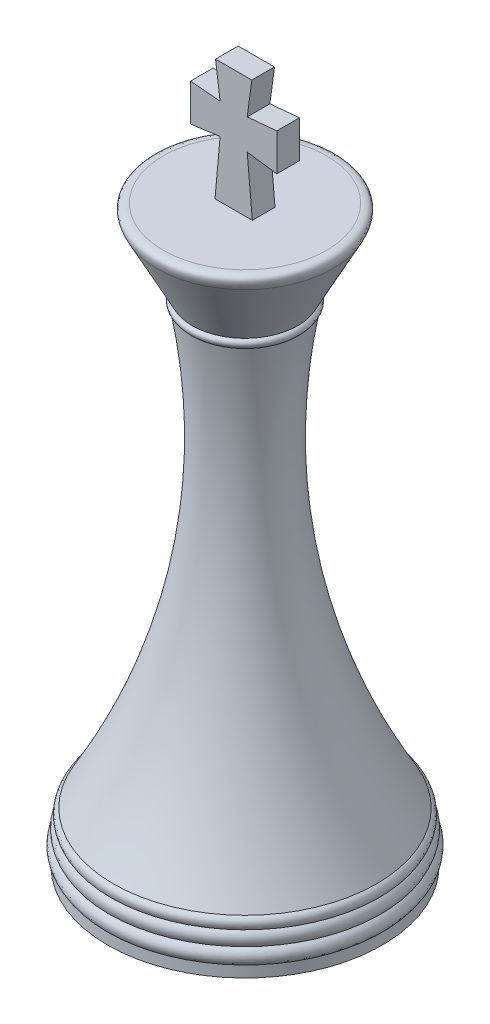
ISO-10303-21;
HEADER;
FILE_DESCRIPTION(('STEP AP214'),'2;1');
FILE_NAME('part.step','',(''),(''),'','','');
FILE_SCHEMA(('AUTOMOTIVE_DESIGN { 1 0 10303 214 1 1 1 1 }'));
ENDSEC;
DATA;
#1=APPLICATION_CONTEXT('core data for automotive mechanical design processes');
#2=APPLICATION_PROTOCOL_DEFINITION('international standard','automotive_design',2000,#1);
#3=PRODUCT_CONTEXT('',#1,'mechanical');
#4=PRODUCT('Part','Part','',(#3));
#5=PRODUCT_RELATED_PRODUCT_CATEGORY('part','',(#4));
#6=PRODUCT_DEFINITION_FORMATION('','',#4);
#7=PRODUCT_DEFINITION_CONTEXT('part definition',#1,'design');
#8=PRODUCT_DEFINITION('design','',#6,#7);
#9=PRODUCT_DEFINITION_SHAPE('','',#8);
#10=(LENGTH_UNIT() NAMED_UNIT(*) SI_UNIT(.MILLI.,.METRE.));
#11=(NAMED_UNIT(*) PLANE_ANGLE_UNIT() SI_UNIT($,.RADIAN.));
#12=(NAMED_UNIT(*) SI_UNIT($,.STERADIAN.) SOLID_ANGLE_UNIT());
#13=UNCERTAINTY_MEASURE_WITH_UNIT(LENGTH_MEASURE(1.E-05),#10,'distance_accuracy_value','');
#14=(GEOMETRIC_REPRESENTATION_CONTEXT(3) GLOBAL_UNCERTAINTY_ASSIGNED_CONTEXT((#13)) GLOBAL_UNIT_ASSIGNED_CONTEXT((#10,
#11,#12)) REPRESENTATION_CONTEXT('',''));
#15=CARTESIAN_POINT('',(0.,0.,0.));
#16=DIRECTION('',(0.,0.,1.));
#17=DIRECTION('',(1.,0.,0.));
#18=AXIS2_PLACEMENT_3D('',#15,#16,#17);
#19=CARTESIAN_POINT('',(-10.8356310623342,40.9219587784721,0.));
#20=DIRECTION('',(0.,1.,0.));
#21=DIRECTION('',(0.,0.,1.));
#22=AXIS2_PLACEMENT_3D('',#19,#20,#21);
#23=PLANE('',#22);
#24=DIRECTION('',(1.,0.,0.));
#25=VECTOR('',#24,1.);
#26=CARTESIAN_POINT('',(2.47207256425345,40.9219587784721,-1.5));
#27=LINE('',#26,#25);
#28=CARTESIAN_POINT('',(-2.47207256425345,40.9219587784721,-1.5));
#29=VERTEX_POINT('',#28);
#30=CARTESIAN_POINT('',(2.47207256425345,40.9219587784721,-1.5));
#31=VERTEX_POINT('',#30);
#32=EDGE_CURVE('E218',#29,#31,#27,.T.);
#33=ORIENTED_EDGE('',*,*,#32,.T.);
#34=DIRECTION('',(0.,0.,1.));
#35=VECTOR('',#34,1.);
#36=CARTESIAN_POINT('',(2.47207256425345,40.9219587784721,-1.5));
#37=LINE('',#36,#35);
#38=CARTESIAN_POINT('',(2.47207256425345,40.9219587784721,1.5));
#39=VERTEX_POINT('',#38);
#40=EDGE_CURVE('E249',#31,#39,#37,.T.);
#41=ORIENTED_EDGE('',*,*,#40,.T.);
#42=DIRECTION('',(1.,0.,0.));
#43=VECTOR('',#42,1.);
#44=CARTESIAN_POINT('',(2.47207256425345,40.9219587784721,1.5));
#45=LINE('',#44,#43);
#46=CARTESIAN_POINT('',(-2.47207256425345,40.9219587784721,1.5));
#47=VERTEX_POINT('',#46);
#48=EDGE_CURVE('E177',#47,#39,#45,.T.);
#49=ORIENTED_EDGE('',*,*,#48,.F.);
#50=DIRECTION('',(0.,0.,1.));
#51=VECTOR('',#50,1.);
#52=CARTESIAN_POINT('',(-2.47207256425345,40.9219587784721,-1.5));
#53=LINE('',#52,#51);
#54=EDGE_CURVE('E253',#29,#47,#53,.T.);
#55=ORIENTED_EDGE('',*,*,#54,.F.);
#56=EDGE_LOOP('',(#33,#41,#49,#55));
#57=FACE_BOUND('',#56,.T.);
#58=CARTESIAN_POINT('',(0.,40.9219587784721,0.));
#59=DIRECTION('',(0.,1.,0.));
#60=DIRECTION('',(0.,0.,1.));
#61=AXIS2_PLACEMENT_3D('',#58,#59,#60);
#62=CIRCLE('',#61,10.8356310623342);
#63=CARTESIAN_POINT('',(0.,40.9219587784721,10.8356310623342));
#64=VERTEX_POINT('',#63);
#65=EDGE_CURVE('E11',#64,#64,#62,.T.);
#66=ORIENTED_EDGE('',*,*,#65,.T.);
#67=EDGE_LOOP('',(#66));
#68=FACE_BOUND('',#67,.T.);
#69=ADVANCED_FACE('F45',(#57,#68),#23,.T.);
#70=CARTESIAN_POINT('',(-10.8356310623342,40.9219587784721,0.));
#71=CARTESIAN_POINT('',(-12.5761824205052,40.9903553282257,0.));
#72=CARTESIAN_POINT('',(-11.6210541476617,39.1907467913078,0.));
#73=B_SPLINE_CURVE_WITH_KNOTS('',2,(#70,#71,#72),.UNSPECIFIED.,.F.,.F.,(3,3),(0.,1.),.UNSPECIFIED.);
#74=CARTESIAN_POINT('',(0.,55.2312224518818,0.));
#75=DIRECTION('',(0.,1.,0.));
#76=AXIS1_PLACEMENT('',#74,#75);
#77=SURFACE_OF_REVOLUTION('',#73,#76);
#78=CARTESIAN_POINT('',(0.,39.1907467913078,0.));
#79=DIRECTION('',(0.,1.,0.));
#80=DIRECTION('',(0.,0.,1.));
#81=AXIS2_PLACEMENT_3D('',#78,#79,#80);
#82=CIRCLE('',#81,11.6210541476617);
#83=CARTESIAN_POINT('',(0.,39.1907467913078,11.6210541476617));
#84=VERTEX_POINT('',#83);
#85=EDGE_CURVE('E53',#84,#84,#82,.T.);
#86=ORIENTED_EDGE('',*,*,#85,.T.);
#87=EDGE_LOOP('',(#86));
#88=FACE_BOUND('',#87,.T.);
#89=ORIENTED_EDGE('',*,*,#65,.F.);
#90=EDGE_LOOP('',(#89));
#91=FACE_BOUND('',#90,.T.);
#92=ADVANCED_FACE('F281',(#88,#91),#77,.F.);
#93=CARTESIAN_POINT('',(0.,39.1907467913078,0.));
#94=DIRECTION('',(0.,1.,0.));
#95=DIRECTION('',(0.,0.,1.));
#96=AXIS2_PLACEMENT_3D('',#93,#94,#95);
#97=CONICAL_SURFACE('',#96,11.6210541476617,0.482185268462013);
#98=CARTESIAN_POINT('',(0.,30.3445693469213,0.));
#99=DIRECTION('',(0.,1.,0.));
#100=DIRECTION('',(0.,0.,1.));
#101=AXIS2_PLACEMENT_3D('',#98,#99,#100);
#102=CIRCLE('',#101,6.99103947930708);
#103=CARTESIAN_POINT('',(0.,30.3445693469213,6.99103947930708));
#104=VERTEX_POINT('',#103);
#105=EDGE_CURVE('E560',#104,#104,#102,.T.);
#106=ORIENTED_EDGE('',*,*,#105,.T.);
#107=EDGE_LOOP('',(#106));
#108=FACE_BOUND('',#107,.T.);
#109=ORIENTED_EDGE('',*,*,#85,.F.);
#110=EDGE_LOOP('',(#109));
#111=FACE_BOUND('',#110,.T.);
#112=ADVANCED_FACE('F284',(#108,#111),#97,.T.);
#113=CARTESIAN_POINT('',(-6.99103947930708,30.3445693469213,0.));
#114=CARTESIAN_POINT('',(-7.42282302865958,30.1336937370813,0.));
#115=CARTESIAN_POINT('',(-7.55993891484378,29.704191996618,0.));
#116=CARTESIAN_POINT('',(-7.02337529144291,29.1899792792963,0.));
#117=B_SPLINE_CURVE_WITH_KNOTS('',3,(#113,#114,#115,#116),.UNSPECIFIED.,.F.,.F.,(4,4),(0.,1.),.UNSPECIFIED.);
#118=CARTESIAN_POINT('',(0.,55.2312224518818,0.));
#119=DIRECTION('',(0.,1.,0.));
#120=AXIS1_PLACEMENT('',#118,#119);
#121=SURFACE_OF_REVOLUTION('',#117,#120);
#122=CARTESIAN_POINT('',(0.,29.1899792792963,0.));
#123=DIRECTION('',(0.,1.,0.));
#124=DIRECTION('',(0.,0.,1.));
#125=AXIS2_PLACEMENT_3D('',#122,#123,#124);
#126=CIRCLE('',#125,7.02337529144291);
#127=CARTESIAN_POINT('',(0.,29.1899792792963,7.02337529144291));
#128=VERTEX_POINT('',#127);
#129=EDGE_CURVE('E555',#128,#128,#126,.T.);
#130=ORIENTED_EDGE('',*,*,#129,.T.);
#131=EDGE_LOOP('',(#130));
#132=FACE_BOUND('',#131,.T.);
#133=ORIENTED_EDGE('',*,*,#105,.F.);
#134=EDGE_LOOP('',(#133));
#135=FACE_BOUND('',#134,.T.);
#136=ADVANCED_FACE('F288',(#132,#135),#121,.F.);
#137=CARTESIAN_POINT('',(-7.02337529144291,29.1899792792963,0.));
#138=CARTESIAN_POINT('',(-1.65074427356781,-0.748893792947071,0.));
#139=CARTESIAN_POINT('',(-17.4406708588037,-28.4410692304664,0.));
#140=B_SPLINE_CURVE_WITH_KNOTS('',2,(#137,#138,#139),.UNSPECIFIED.,.F.,.F.,(3,3),(0.,1.),.UNSPECIFIED.);
#141=CARTESIAN_POINT('',(0.,55.2312224518818,0.));
#142=DIRECTION('',(0.,1.,0.));
#143=AXIS1_PLACEMENT('',#141,#142);
#144=SURFACE_OF_REVOLUTION('',#140,#143);
#145=CARTESIAN_POINT('',(0.,-28.4410692304664,0.));
#146=DIRECTION('',(0.,1.,0.));
#147=DIRECTION('',(0.,0.,1.));
#148=AXIS2_PLACEMENT_3D('',#145,#146,#147);
#149=CIRCLE('',#148,17.4406708588037);
#150=CARTESIAN_POINT('',(0.,-28.4410692304664,17.4406708588037));
#151=VERTEX_POINT('',#150);
#152=EDGE_CURVE('E553',#151,#151,#149,.T.);
#153=ORIENTED_EDGE('',*,*,#152,.T.);
#154=EDGE_LOOP('',(#153));
#155=FACE_BOUND('',#154,.T.);
#156=ORIENTED_EDGE('',*,*,#129,.F.);
#157=EDGE_LOOP('',(#156));
#158=FACE_BOUND('',#157,.T.);
#159=ADVANCED_FACE('F292',(#155,#158),#144,.F.);
#160=CARTESIAN_POINT('',(-17.4406708588037,-28.4410692304664,0.));
#161=CARTESIAN_POINT('',(-18.2383972493109,-28.9552709631702,0.));
#162=CARTESIAN_POINT('',(-17.7523294859476,-29.8824903810067,0.));
#163=B_SPLINE_CURVE_WITH_KNOTS('',2,(#160,#161,#162),.UNSPECIFIED.,.F.,.F.,(3,3),(0.,1.),.UNSPECIFIED.);
#164=CARTESIAN_POINT('',(0.,55.2312224518818,0.));
#165=DIRECTION('',(0.,1.,0.));
#166=AXIS1_PLACEMENT('',#164,#165);
#167=SURFACE_OF_REVOLUTION('',#163,#166);
#168=CARTESIAN_POINT('',(0.,-29.8824903810067,0.));
#169=DIRECTION('',(0.,1.,0.));
#170=DIRECTION('',(0.,0.,1.));
#171=AXIS2_PLACEMENT_3D('',#168,#169,#170);
#172=CIRCLE('',#171,17.7523294859476);
#173=CARTESIAN_POINT('',(0.,-29.8824903810067,17.7523294859476));
#174=VERTEX_POINT('',#173);
#175=EDGE_CURVE('E550',#174,#174,#172,.T.);
#176=ORIENTED_EDGE('',*,*,#175,.T.);
#177=EDGE_LOOP('',(#176));
#178=FACE_BOUND('',#177,.T.);
#179=ORIENTED_EDGE('',*,*,#152,.F.);
#180=EDGE_LOOP('',(#179));
#181=FACE_BOUND('',#180,.T.);
#182=ADVANCED_FACE('F296',(#178,#181),#167,.F.);
#183=CARTESIAN_POINT('',(-17.7523294859476,-29.8824903810067,0.));
#184=CARTESIAN_POINT('',(-18.565257787873,-30.6179166788361,0.));
#185=CARTESIAN_POINT('',(-17.9784864878763,-31.656539775019,0.));
#186=B_SPLINE_CURVE_WITH_KNOTS('',2,(#183,#184,#185),.UNSPECIFIED.,.F.,.F.,(3,3),(0.,1.),.UNSPECIFIED.);
#187=CARTESIAN_POINT('',(0.,55.2312224518818,0.));
#188=DIRECTION('',(0.,1.,0.));
#189=AXIS1_PLACEMENT('',#187,#188);
#190=SURFACE_OF_REVOLUTION('',#186,#189);
#191=CARTESIAN_POINT('',(0.,-31.656539775019,0.));
#192=DIRECTION('',(0.,1.,0.));
#193=DIRECTION('',(0.,0.,1.));
#194=AXIS2_PLACEMENT_3D('',#191,#192,#193);
#195=CIRCLE('',#194,17.9784864878763);
#196=CARTESIAN_POINT('',(0.,-31.656539775019,17.9784864878763));
#197=VERTEX_POINT('',#196);
#198=EDGE_CURVE('E562',#197,#197,#195,.T.);
#199=ORIENTED_EDGE('',*,*,#198,.T.);
#200=EDGE_LOOP('',(#199));
#201=FACE_BOUND('',#200,.T.);
#202=ORIENTED_EDGE('',*,*,#175,.F.);
#203=EDGE_LOOP('',(#202));
#204=FACE_BOUND('',#203,.T.);
#205=ADVANCED_FACE('F324',(#201,#204),#190,.F.);
#206=CARTESIAN_POINT('',(-17.9784864878763,-31.656539775019,0.));
#207=CARTESIAN_POINT('',(-18.649381124143,-32.2176109902792,0.));
#208=CARTESIAN_POINT('',(-18.7467778361812,-32.9387169198661,0.));
#209=CARTESIAN_POINT('',(-18.1746290266333,-33.6223939067329,0.));
#210=B_SPLINE_CURVE_WITH_KNOTS('',3,(#206,#207,#208,#209),.UNSPECIFIED.,.F.,.F.,(4,4),(0.,1.),.UNSPECIFIED.);
#211=CARTESIAN_POINT('',(0.,55.2312224518818,0.));
#212=DIRECTION('',(0.,1.,0.));
#213=AXIS1_PLACEMENT('',#211,#212);
#214=SURFACE_OF_REVOLUTION('',#210,#213);
#215=CARTESIAN_POINT('',(0.,-33.6223939067329,0.));
#216=DIRECTION('',(0.,1.,0.));
#217=DIRECTION('',(0.,0.,1.));
#218=AXIS2_PLACEMENT_3D('',#215,#216,#217);
#219=CIRCLE('',#218,18.1746290266333);
#220=CARTESIAN_POINT('',(0.,-33.6223939067329,18.1746290266333));
#221=VERTEX_POINT('',#220);
#222=EDGE_CURVE('E577',#221,#221,#219,.T.);
#223=ORIENTED_EDGE('',*,*,#222,.T.);
#224=EDGE_LOOP('',(#223));
#225=FACE_BOUND('',#224,.T.);
#226=ORIENTED_EDGE('',*,*,#198,.F.);
#227=EDGE_LOOP('',(#226));
#228=FACE_BOUND('',#227,.T.);
#229=ADVANCED_FACE('F327',(#225,#228),#214,.F.);
#230=CARTESIAN_POINT('',(0.,55.2312224518818,0.));
#231=DIRECTION('',(0.,1.,0.));
#232=DIRECTION('',(0.,0.,1.));
#233=AXIS2_PLACEMENT_3D('',#230,#231,#232);
#234=CYLINDRICAL_SURFACE('',#233,18.1746290266333);
#235=CARTESIAN_POINT('',(0.,-35.1126054521372,0.));
#236=DIRECTION('',(0.,1.,0.));
#237=DIRECTION('',(0.,0.,1.));
#238=AXIS2_PLACEMENT_3D('',#235,#236,#237);
#239=CIRCLE('',#238,18.1746290266333);
#240=CARTESIAN_POINT('',(0.,-35.1126054521372,18.1746290266333));
#241=VERTEX_POINT('',#240);
#242=EDGE_CURVE('E239',#241,#241,#239,.T.);
#243=ORIENTED_EDGE('',*,*,#242,.T.);
#244=EDGE_LOOP('',(#243));
#245=FACE_BOUND('',#244,.T.);
#246=ORIENTED_EDGE('',*,*,#222,.F.);
#247=EDGE_LOOP('',(#246));
#248=FACE_BOUND('',#247,.T.);
#249=ADVANCED_FACE('F331',(#245,#248),#234,.T.);
#250=CARTESIAN_POINT('',(0.,-35.1126054521372,0.));
#251=DIRECTION('',(0.,-1.,0.));
#252=DIRECTION('',(0.,0.,-1.));
#253=AXIS2_PLACEMENT_3D('',#250,#251,#252);
#254=PLANE('',#253);
#255=ORIENTED_EDGE('',*,*,#242,.F.);
#256=EDGE_LOOP('',(#255));
#257=FACE_BOUND('',#256,.T.);
#258=ADVANCED_FACE('F335',(#257),#254,.T.);
#259=CARTESIAN_POINT('',(1.79345498502959,52.4487400912058,-1.5));
#260=DIRECTION('',(0.991029227048475,-0.133645318420446,0.));
#261=DIRECTION('',(0.133645318420446,0.991029227048475,0.));
#262=AXIS2_PLACEMENT_3D('',#259,#260,#261);
#263=PLANE('',#262);
#264=DIRECTION('',(0.,0.,1.));
#265=VECTOR('',#264,1.);
#266=CARTESIAN_POINT('',(2.40460317666927,56.9806288781166,-1.5));
#267=LINE('',#266,#265);
#268=CARTESIAN_POINT('',(2.40460317666927,56.9806288781166,-1.5));
#269=VERTEX_POINT('',#268);
#270=CARTESIAN_POINT('',(2.40460317666927,56.9806288781166,1.5));
#271=VERTEX_POINT('',#270);
#272=EDGE_CURVE('E133',#269,#271,#267,.T.);
#273=ORIENTED_EDGE('',*,*,#272,.T.);
#274=DIRECTION('',(0.133645318420446,0.991029227048475,0.));
#275=VECTOR('',#274,1.);
#276=CARTESIAN_POINT('',(1.79345498502959,52.4487400912058,1.5));
#277=LINE('',#276,#275);
#278=CARTESIAN_POINT('',(1.79345498502959,52.4487400912058,1.5));
#279=VERTEX_POINT('',#278);
#280=EDGE_CURVE('E137',#279,#271,#277,.T.);
#281=ORIENTED_EDGE('',*,*,#280,.F.);
#282=DIRECTION('',(0.,0.,1.));
#283=VECTOR('',#282,1.);
#284=CARTESIAN_POINT('',(1.79345498502959,52.4487400912058,-1.5));
#285=LINE('',#284,#283);
#286=CARTESIAN_POINT('',(1.79345498502959,52.4487400912058,-1.5));
#287=VERTEX_POINT('',#286);
#288=EDGE_CURVE('E68',#287,#279,#285,.T.);
#289=ORIENTED_EDGE('',*,*,#288,.F.);
#290=DIRECTION('',(0.133645318420446,0.991029227048475,0.));
#291=VECTOR('',#290,1.);
#292=CARTESIAN_POINT('',(1.79345498502959,52.4487400912058,-1.5));
#293=LINE('',#292,#291);
#294=EDGE_CURVE('E138',#287,#269,#293,.T.);
#295=ORIENTED_EDGE('',*,*,#294,.T.);
#296=EDGE_LOOP('',(#273,#281,#289,#295));
#297=FACE_BOUND('',#296,.T.);
#298=ADVANCED_FACE('F135',(#297),#263,.T.);
#299=CARTESIAN_POINT('',(5.71326235771109,52.8040972385139,-1.5));
#300=DIRECTION('',(-0.0902865306899447,0.995915830969653,0.));
#301=DIRECTION('',(-0.995915830969653,-0.0902865306899447,0.));
#302=AXIS2_PLACEMENT_3D('',#299,#300,#301);
#303=PLANE('',#302);
#304=ORIENTED_EDGE('',*,*,#288,.T.);
#305=DIRECTION('',(-0.995915830969653,-0.0902865306899447,0.));
#306=VECTOR('',#305,1.);
#307=CARTESIAN_POINT('',(5.71326235771109,52.8040972385139,1.5));
#308=LINE('',#307,#306);
#309=CARTESIAN_POINT('',(5.71326235771109,52.8040972385139,1.5));
#310=VERTEX_POINT('',#309);
#311=EDGE_CURVE('E158',#310,#279,#308,.T.);
#312=ORIENTED_EDGE('',*,*,#311,.F.);
#313=DIRECTION('',(0.,0.,1.));
#314=VECTOR('',#313,1.);
#315=CARTESIAN_POINT('',(5.71326235771109,52.8040972385139,-1.5));
#316=LINE('',#315,#314);
#317=CARTESIAN_POINT('',(5.71326235771109,52.8040972385139,-1.5));
#318=VERTEX_POINT('',#317);
#319=EDGE_CURVE('E240',#318,#310,#316,.T.);
#320=ORIENTED_EDGE('',*,*,#319,.F.);
#321=DIRECTION('',(-0.995915830969653,-0.0902865306899447,0.));
#322=VECTOR('',#321,1.);
#323=CARTESIAN_POINT('',(5.71326235771109,52.8040972385139,-1.5));
#324=LINE('',#323,#322);
#325=EDGE_CURVE('E144',#318,#287,#324,.T.);
#326=ORIENTED_EDGE('',*,*,#325,.T.);
#327=EDGE_LOOP('',(#304,#312,#320,#326));
#328=FACE_BOUND('',#327,.T.);
#329=ADVANCED_FACE('F342',(#328),#303,.T.);
#330=CARTESIAN_POINT('',(5.71326235771109,47.878921151301,-1.5));
#331=DIRECTION('',(1.,0.,0.));
#332=DIRECTION('',(0.,0.,-1.));
#333=AXIS2_PLACEMENT_3D('',#330,#331,#332);
#334=PLANE('',#333);
#335=ORIENTED_EDGE('',*,*,#319,.T.);
#336=DIRECTION('',(0.,1.,0.));
#337=VECTOR('',#336,1.);
#338=CARTESIAN_POINT('',(5.71326235771109,47.878921151301,1.5));
#339=LINE('',#338,#337);
#340=CARTESIAN_POINT('',(5.71326235771109,47.878921151301,1.5));
#341=VERTEX_POINT('',#340);
#342=EDGE_CURVE('E188',#341,#310,#339,.T.);
#343=ORIENTED_EDGE('',*,*,#342,.F.);
#344=DIRECTION('',(0.,0.,1.));
#345=VECTOR('',#344,1.);
#346=CARTESIAN_POINT('',(5.71326235771109,47.878921151301,-1.5));
#347=LINE('',#346,#345);
#348=CARTESIAN_POINT('',(5.71326235771109,47.878921151301,-1.5));
#349=VERTEX_POINT('',#348);
#350=EDGE_CURVE('E243',#349,#341,#347,.T.);
#351=ORIENTED_EDGE('',*,*,#350,.F.);
#352=DIRECTION('',(0.,1.,0.));
#353=VECTOR('',#352,1.);
#354=CARTESIAN_POINT('',(5.71326235771109,47.878921151301,-1.5));
#355=LINE('',#354,#353);
#356=EDGE_CURVE('E230',#349,#318,#355,.T.);
#357=ORIENTED_EDGE('',*,*,#356,.T.);
#358=EDGE_LOOP('',(#335,#343,#351,#357));
#359=FACE_BOUND('',#358,.T.);
#360=ADVANCED_FACE('F373',(#359),#334,.T.);
#361=CARTESIAN_POINT('',(1.79345498502959,48.4075270593518,-1.5));
#362=DIRECTION('',(-0.133645318420448,-0.991029227048475,0.));
#363=DIRECTION('',(0.991029227048475,-0.133645318420448,0.));
#364=AXIS2_PLACEMENT_3D('',#361,#362,#363);
#365=PLANE('',#364);
#366=ORIENTED_EDGE('',*,*,#350,.T.);
#367=DIRECTION('',(0.991029227048475,-0.133645318420448,0.));
#368=VECTOR('',#367,1.);
#369=CARTESIAN_POINT('',(1.79345498502959,48.4075270593518,1.5));
#370=LINE('',#369,#368);
#371=CARTESIAN_POINT('',(1.79345498502959,48.4075270593518,1.5));
#372=VERTEX_POINT('',#371);
#373=EDGE_CURVE('E184',#372,#341,#370,.T.);
#374=ORIENTED_EDGE('',*,*,#373,.F.);
#375=DIRECTION('',(0.,0.,1.));
#376=VECTOR('',#375,1.);
#377=CARTESIAN_POINT('',(1.79345498502959,48.4075270593518,-1.5));
#378=LINE('',#377,#376);
#379=CARTESIAN_POINT('',(1.79345498502959,48.4075270593518,-1.5));
#380=VERTEX_POINT('',#379);
#381=EDGE_CURVE('E246',#380,#372,#378,.T.);
#382=ORIENTED_EDGE('',*,*,#381,.F.);
#383=DIRECTION('',(0.991029227048475,-0.133645318420448,0.));
#384=VECTOR('',#383,1.);
#385=CARTESIAN_POINT('',(1.79345498502959,48.4075270593518,-1.5));
#386=LINE('',#385,#384);
#387=EDGE_CURVE('E226',#380,#349,#386,.T.);
#388=ORIENTED_EDGE('',*,*,#387,.T.);
#389=EDGE_LOOP('',(#366,#374,#382,#388));
#390=FACE_BOUND('',#389,.T.);
#391=ADVANCED_FACE('F369',(#390),#365,.T.);
#392=CARTESIAN_POINT('',(2.47207256425345,40.9219587784721,-1.5));
#393=DIRECTION('',(0.995915830969652,0.0902865306899482,0.));
#394=DIRECTION('',(-0.0902865306899482,0.995915830969652,0.));
#395=AXIS2_PLACEMENT_3D('',#392,#393,#394);
#396=PLANE('',#395);
#397=ORIENTED_EDGE('',*,*,#381,.T.);
#398=DIRECTION('',(-0.0902865306899482,0.995915830969652,0.));
#399=VECTOR('',#398,1.);
#400=CARTESIAN_POINT('',(2.47207256425345,40.9219587784721,1.5));
#401=LINE('',#400,#399);
#402=EDGE_CURVE('E180',#39,#372,#401,.T.);
#403=ORIENTED_EDGE('',*,*,#402,.F.);
#404=ORIENTED_EDGE('',*,*,#40,.F.);
#405=DIRECTION('',(-0.0902865306899482,0.995915830969652,0.));
#406=VECTOR('',#405,1.);
#407=CARTESIAN_POINT('',(2.47207256425345,40.9219587784721,-1.5));
#408=LINE('',#407,#406);
#409=EDGE_CURVE('E222',#31,#380,#408,.T.);
#410=ORIENTED_EDGE('',*,*,#409,.T.);
#411=EDGE_LOOP('',(#397,#403,#404,#410));
#412=FACE_BOUND('',#411,.T.);
#413=ADVANCED_FACE('F365',(#412),#396,.T.);
#414=CARTESIAN_POINT('',(-2.47207256425345,40.9219587784721,-1.5));
#415=DIRECTION('',(-0.995915830969652,0.090286530689948,0.));
#416=DIRECTION('',(-0.090286530689948,-0.995915830969652,0.));
#417=AXIS2_PLACEMENT_3D('',#414,#415,#416);
#418=PLANE('',#417);
#419=ORIENTED_EDGE('',*,*,#54,.T.);
#420=DIRECTION('',(-0.090286530689948,-0.995915830969652,0.));
#421=VECTOR('',#420,1.);
#422=CARTESIAN_POINT('',(-2.47207256425345,40.9219587784721,1.5));
#423=LINE('',#422,#421);
#424=CARTESIAN_POINT('',(-1.79345498502959,48.4075270593518,1.5));
#425=VERTEX_POINT('',#424);
#426=EDGE_CURVE('E60',#425,#47,#423,.T.);
#427=ORIENTED_EDGE('',*,*,#426,.F.);
#428=DIRECTION('',(0.,0.,1.));
#429=VECTOR('',#428,1.);
#430=CARTESIAN_POINT('',(-1.79345498502959,48.4075270593518,-1.5));
#431=LINE('',#430,#429);
#432=CARTESIAN_POINT('',(-1.79345498502959,48.4075270593518,-1.5));
#433=VERTEX_POINT('',#432);
#434=EDGE_CURVE('E256',#433,#425,#431,.T.);
#435=ORIENTED_EDGE('',*,*,#434,.F.);
#436=DIRECTION('',(-0.090286530689948,-0.995915830969652,0.));
#437=VECTOR('',#436,1.);
#438=CARTESIAN_POINT('',(-2.47207256425345,40.9219587784721,-1.5));
#439=LINE('',#438,#437);
#440=EDGE_CURVE('E214',#433,#29,#439,.T.);
#441=ORIENTED_EDGE('',*,*,#440,.T.);
#442=EDGE_LOOP('',(#419,#427,#435,#441));
#443=FACE_BOUND('',#442,.T.);
#444=ADVANCED_FACE('F361',(#443),#418,.T.);
#445=CARTESIAN_POINT('',(-1.79345498502959,48.4075270593518,-1.5));
#446=DIRECTION('',(0.133645318420448,-0.991029227048475,0.));
#447=DIRECTION('',(0.991029227048475,0.133645318420448,0.));
#448=AXIS2_PLACEMENT_3D('',#445,#446,#447);
#449=PLANE('',#448);
#450=ORIENTED_EDGE('',*,*,#434,.T.);
#451=DIRECTION('',(0.991029227048475,0.133645318420448,0.));
#452=VECTOR('',#451,1.);
#453=CARTESIAN_POINT('',(-1.79345498502959,48.4075270593518,1.5));
#454=LINE('',#453,#452);
#455=CARTESIAN_POINT('',(-5.71326235771109,47.878921151301,1.5));
#456=VERTEX_POINT('',#455);
#457=EDGE_CURVE('E172',#456,#425,#454,.T.);
#458=ORIENTED_EDGE('',*,*,#457,.F.);
#459=DIRECTION('',(0.,0.,1.));
#460=VECTOR('',#459,1.);
#461=CARTESIAN_POINT('',(-5.71326235771109,47.878921151301,-1.5));
#462=LINE('',#461,#460);
#463=CARTESIAN_POINT('',(-5.71326235771109,47.878921151301,-1.5));
#464=VERTEX_POINT('',#463);
#465=EDGE_CURVE('E259',#464,#456,#462,.T.);
#466=ORIENTED_EDGE('',*,*,#465,.F.);
#467=DIRECTION('',(0.991029227048475,0.133645318420448,0.));
#468=VECTOR('',#467,1.);
#469=CARTESIAN_POINT('',(-1.79345498502959,48.4075270593518,-1.5));
#470=LINE('',#469,#468);
#471=EDGE_CURVE('E210',#464,#433,#470,.T.);
#472=ORIENTED_EDGE('',*,*,#471,.T.);
#473=EDGE_LOOP('',(#450,#458,#466,#472));
#474=FACE_BOUND('',#473,.T.);
#475=ADVANCED_FACE('F357',(#474),#449,.T.);
#476=CARTESIAN_POINT('',(-5.71326235771109,47.878921151301,-1.5));
#477=DIRECTION('',(-1.,0.,0.));
#478=DIRECTION('',(0.,0.,1.));
#479=AXIS2_PLACEMENT_3D('',#476,#477,#478);
#480=PLANE('',#479);
#481=ORIENTED_EDGE('',*,*,#465,.T.);
#482=DIRECTION('',(0.,-1.,0.));
#483=VECTOR('',#482,1.);
#484=CARTESIAN_POINT('',(-5.71326235771109,47.878921151301,1.5));
#485=LINE('',#484,#483);
#486=CARTESIAN_POINT('',(-5.71326235771109,52.8040972385139,1.5));
#487=VERTEX_POINT('',#486);
#488=EDGE_CURVE('E168',#487,#456,#485,.T.);
#489=ORIENTED_EDGE('',*,*,#488,.F.);
#490=DIRECTION('',(0.,0.,1.));
#491=VECTOR('',#490,1.);
#492=CARTESIAN_POINT('',(-5.71326235771109,52.8040972385139,-1.5));
#493=LINE('',#492,#491);
#494=CARTESIAN_POINT('',(-5.71326235771109,52.8040972385139,-1.5));
#495=VERTEX_POINT('',#494);
#496=EDGE_CURVE('E262',#495,#487,#493,.T.);
#497=ORIENTED_EDGE('',*,*,#496,.F.);
#498=DIRECTION('',(0.,-1.,0.));
#499=VECTOR('',#498,1.);
#500=CARTESIAN_POINT('',(-5.71326235771109,47.878921151301,-1.5));
#501=LINE('',#500,#499);
#502=EDGE_CURVE('E206',#495,#464,#501,.T.);
#503=ORIENTED_EDGE('',*,*,#502,.T.);
#504=EDGE_LOOP('',(#481,#489,#497,#503));
#505=FACE_BOUND('',#504,.T.);
#506=ADVANCED_FACE('F353',(#505),#480,.T.);
#507=CARTESIAN_POINT('',(-5.71326235771109,52.8040972385139,-1.5));
#508=DIRECTION('',(0.0902865306899482,0.995915830969652,0.));
#509=DIRECTION('',(-0.995915830969652,0.0902865306899482,0.));
#510=AXIS2_PLACEMENT_3D('',#507,#508,#509);
#511=PLANE('',#510);
#512=ORIENTED_EDGE('',*,*,#496,.T.);
#513=DIRECTION('',(-0.995915830969652,0.0902865306899482,0.));
#514=VECTOR('',#513,1.);
#515=CARTESIAN_POINT('',(-5.71326235771109,52.8040972385139,1.5));
#516=LINE('',#515,#514);
#517=CARTESIAN_POINT('',(-1.79345498502959,52.4487400912058,1.5));
#518=VERTEX_POINT('',#517);
#519=EDGE_CURVE('E164',#518,#487,#516,.T.);
#520=ORIENTED_EDGE('',*,*,#519,.F.);
#521=DIRECTION('',(0.,0.,1.));
#522=VECTOR('',#521,1.);
#523=CARTESIAN_POINT('',(-1.79345498502959,52.4487400912058,-1.5));
#524=LINE('',#523,#522);
#525=CARTESIAN_POINT('',(-1.79345498502959,52.4487400912058,-1.5));
#526=VERTEX_POINT('',#525);
#527=EDGE_CURVE('E265',#526,#518,#524,.T.);
#528=ORIENTED_EDGE('',*,*,#527,.F.);
#529=DIRECTION('',(-0.995915830969652,0.0902865306899482,0.));
#530=VECTOR('',#529,1.);
#531=CARTESIAN_POINT('',(-5.71326235771109,52.8040972385139,-1.5));
#532=LINE('',#531,#530);
#533=EDGE_CURVE('E202',#526,#495,#532,.T.);
#534=ORIENTED_EDGE('',*,*,#533,.T.);
#535=EDGE_LOOP('',(#512,#520,#528,#534));
#536=FACE_BOUND('',#535,.T.);
#537=ADVANCED_FACE('F349',(#536),#511,.T.);
#538=CARTESIAN_POINT('',(-1.79345498502959,52.4487400912058,-1.5));
#539=DIRECTION('',(-0.991029227048475,-0.133645318420448,0.));
#540=DIRECTION('',(0.133645318420448,-0.991029227048475,0.));
#541=AXIS2_PLACEMENT_3D('',#538,#539,#540);
#542=PLANE('',#541);
#543=ORIENTED_EDGE('',*,*,#527,.T.);
#544=DIRECTION('',(0.133645318420448,-0.991029227048475,0.));
#545=VECTOR('',#544,1.);
#546=CARTESIAN_POINT('',(-1.79345498502959,52.4487400912058,1.5));
#547=LINE('',#546,#545);
#548=CARTESIAN_POINT('',(-2.40460317666928,56.9806288781166,1.5));
#549=VERTEX_POINT('',#548);
#550=EDGE_CURVE('E152',#549,#518,#547,.T.);
#551=ORIENTED_EDGE('',*,*,#550,.F.);
#552=DIRECTION('',(0.,0.,1.));
#553=VECTOR('',#552,1.);
#554=CARTESIAN_POINT('',(-2.40460317666928,56.9806288781166,-1.5));
#555=LINE('',#554,#553);
#556=CARTESIAN_POINT('',(-2.40460317666928,56.9806288781166,-1.5));
#557=VERTEX_POINT('',#556);
#558=EDGE_CURVE('E143',#557,#549,#555,.T.);
#559=ORIENTED_EDGE('',*,*,#558,.F.);
#560=DIRECTION('',(0.133645318420448,-0.991029227048475,0.));
#561=VECTOR('',#560,1.);
#562=CARTESIAN_POINT('',(-1.79345498502959,52.4487400912058,-1.5));
#563=LINE('',#562,#561);
#564=EDGE_CURVE('E198',#557,#526,#563,.T.);
#565=ORIENTED_EDGE('',*,*,#564,.T.);
#566=EDGE_LOOP('',(#543,#551,#559,#565));
#567=FACE_BOUND('',#566,.T.);
#568=ADVANCED_FACE('F346',(#567),#542,.T.);
#569=CARTESIAN_POINT('',(-2.40460317666928,56.9806288781166,-1.5));
#570=DIRECTION('',(0.,1.,0.));
#571=DIRECTION('',(0.,0.,1.));
#572=AXIS2_PLACEMENT_3D('',#569,#570,#571);
#573=PLANE('',#572);
#574=ORIENTED_EDGE('',*,*,#558,.T.);
#575=DIRECTION('',(-1.,0.,0.));
#576=VECTOR('',#575,1.);
#577=CARTESIAN_POINT('',(-2.40460317666928,56.9806288781166,1.5));
#578=LINE('',#577,#576);
#579=EDGE_CURVE('E147',#271,#549,#578,.T.);
#580=ORIENTED_EDGE('',*,*,#579,.F.);
#581=ORIENTED_EDGE('',*,*,#272,.F.);
#582=DIRECTION('',(-1.,0.,0.));
#583=VECTOR('',#582,1.);
#584=CARTESIAN_POINT('',(-2.40460317666928,56.9806288781166,-1.5));
#585=LINE('',#584,#583);
#586=EDGE_CURVE('E195',#269,#557,#585,.T.);
#587=ORIENTED_EDGE('',*,*,#586,.T.);
#588=EDGE_LOOP('',(#574,#580,#581,#587));
#589=FACE_BOUND('',#588,.T.);
#590=ADVANCED_FACE('F148',(#589),#573,.T.);
#591=CARTESIAN_POINT('',(0.,0.,-1.5));
#592=DIRECTION('',(0.,0.,-1.));
#593=DIRECTION('',(-1.,0.,0.));
#594=AXIS2_PLACEMENT_3D('',#591,#592,#593);
#595=PLANE('',#594);
#596=ORIENTED_EDGE('',*,*,#294,.F.);
#597=ORIENTED_EDGE('',*,*,#325,.F.);
#598=ORIENTED_EDGE('',*,*,#356,.F.);
#599=ORIENTED_EDGE('',*,*,#387,.F.);
#600=ORIENTED_EDGE('',*,*,#409,.F.);
#601=ORIENTED_EDGE('',*,*,#32,.F.);
#602=ORIENTED_EDGE('',*,*,#440,.F.);
#603=ORIENTED_EDGE('',*,*,#471,.F.);
#604=ORIENTED_EDGE('',*,*,#502,.F.);
#605=ORIENTED_EDGE('',*,*,#533,.F.);
#606=ORIENTED_EDGE('',*,*,#564,.F.);
#607=ORIENTED_EDGE('',*,*,#586,.F.);
#608=EDGE_LOOP('',(#596,#597,#598,#599,#600,#601,#602,#603,#604,#605,#606,#607));
#609=FACE_BOUND('',#608,.T.);
#610=ADVANCED_FACE('F345',(#609),#595,.T.);
#611=CARTESIAN_POINT('',(0.,0.,1.5));
#612=DIRECTION('',(0.,0.,-1.));
#613=DIRECTION('',(-1.,0.,0.));
#614=AXIS2_PLACEMENT_3D('',#611,#612,#613);
#615=PLANE('',#614);
#616=ORIENTED_EDGE('',*,*,#280,.T.);
#617=ORIENTED_EDGE('',*,*,#579,.T.);
#618=ORIENTED_EDGE('',*,*,#550,.T.);
#619=ORIENTED_EDGE('',*,*,#519,.T.);
#620=ORIENTED_EDGE('',*,*,#488,.T.);
#621=ORIENTED_EDGE('',*,*,#457,.T.);
#622=ORIENTED_EDGE('',*,*,#426,.T.);
#623=ORIENTED_EDGE('',*,*,#48,.T.);
#624=ORIENTED_EDGE('',*,*,#402,.T.);
#625=ORIENTED_EDGE('',*,*,#373,.T.);
#626=ORIENTED_EDGE('',*,*,#342,.T.);
#627=ORIENTED_EDGE('',*,*,#311,.T.);
#628=EDGE_LOOP('',(#616,#617,#618,#619,#620,#621,#622,#623,#624,#625,#626,#627));
#629=FACE_BOUND('',#628,.T.);
#630=ADVANCED_FACE('F155',(#629),#615,.F.);
#631=CLOSED_SHELL('',(#69,#92,#112,#136,#159,#182,#205,#229,#249,#258,#298,#329,#360,#391,#413,
#444,#475,#506,#537,#568,#590,#610,#630));
#632=MANIFOLD_SOLID_BREP('B2',#631);
#633=ADVANCED_BREP_SHAPE_REPRESENTATION('',(#18,#632),#14);
#634=SHAPE_DEFINITION_REPRESENTATION(#9,#633);
ENDSEC;
END-ISO-10303-21;
